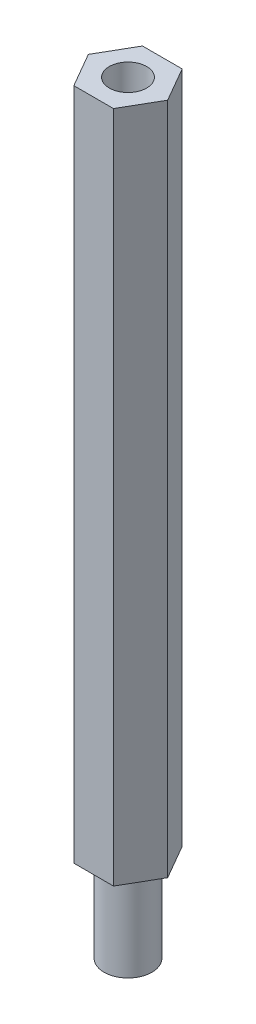
ISO-10303-21;
HEADER;
FILE_DESCRIPTION(('STEP AP214'),'2;1');
FILE_NAME('part.step','',(''),(''),'','','');
FILE_SCHEMA(('AUTOMOTIVE_DESIGN { 1 0 10303 214 1 1 1 1 }'));
ENDSEC;
DATA;
#1=APPLICATION_CONTEXT('core data for automotive mechanical design processes');
#2=APPLICATION_PROTOCOL_DEFINITION('international standard','automotive_design',2000,#1);
#3=PRODUCT_CONTEXT('',#1,'mechanical');
#4=PRODUCT('Part','Part','',(#3));
#5=PRODUCT_RELATED_PRODUCT_CATEGORY('part','',(#4));
#6=PRODUCT_DEFINITION_FORMATION('','',#4);
#7=PRODUCT_DEFINITION_CONTEXT('part definition',#1,'design');
#8=PRODUCT_DEFINITION('design','',#6,#7);
#9=PRODUCT_DEFINITION_SHAPE('','',#8);
#10=(LENGTH_UNIT() NAMED_UNIT(*) SI_UNIT(.MILLI.,.METRE.));
#11=(NAMED_UNIT(*) PLANE_ANGLE_UNIT() SI_UNIT($,.RADIAN.));
#12=(NAMED_UNIT(*) SI_UNIT($,.STERADIAN.) SOLID_ANGLE_UNIT());
#13=UNCERTAINTY_MEASURE_WITH_UNIT(LENGTH_MEASURE(1.E-05),#10,'distance_accuracy_value','');
#14=(GEOMETRIC_REPRESENTATION_CONTEXT(3) GLOBAL_UNCERTAINTY_ASSIGNED_CONTEXT((#13)) GLOBAL_UNIT_ASSIGNED_CONTEXT((#10,
#11,#12)) REPRESENTATION_CONTEXT('',''));
#15=CARTESIAN_POINT('',(0.,0.,0.));
#16=DIRECTION('',(0.,0.,1.));
#17=DIRECTION('',(1.,0.,0.));
#18=AXIS2_PLACEMENT_3D('',#15,#16,#17);
#19=CARTESIAN_POINT('',(-1.325,45.,2.29496732002876));
#20=DIRECTION('',(0.,0.,-1.));
#21=DIRECTION('',(-1.,0.,0.));
#22=AXIS2_PLACEMENT_3D('',#19,#20,#21);
#23=PLANE('',#22);
#24=DIRECTION('',(1.,0.,0.));
#25=VECTOR('',#24,1.);
#26=CARTESIAN_POINT('',(-1.325,0.,2.29496732002876));
#27=LINE('',#26,#25);
#28=CARTESIAN_POINT('',(-1.325,0.,2.29496732002876));
#29=VERTEX_POINT('',#28);
#30=CARTESIAN_POINT('',(1.325,0.,2.29496732002876));
#31=VERTEX_POINT('',#30);
#32=EDGE_CURVE('E122',#29,#31,#27,.T.);
#33=ORIENTED_EDGE('',*,*,#32,.T.);
#34=DIRECTION('',(0.,-1.,0.));
#35=VECTOR('',#34,1.);
#36=CARTESIAN_POINT('',(1.325,45.,2.29496732002876));
#37=LINE('',#36,#35);
#38=CARTESIAN_POINT('',(1.325,45.,2.29496732002876));
#39=VERTEX_POINT('',#38);
#40=EDGE_CURVE('E45',#39,#31,#37,.T.);
#41=ORIENTED_EDGE('',*,*,#40,.F.);
#42=DIRECTION('',(1.,0.,0.));
#43=VECTOR('',#42,1.);
#44=CARTESIAN_POINT('',(-1.325,45.,2.29496732002876));
#45=LINE('',#44,#43);
#46=CARTESIAN_POINT('',(-1.325,45.,2.29496732002876));
#47=VERTEX_POINT('',#46);
#48=EDGE_CURVE('E133',#47,#39,#45,.T.);
#49=ORIENTED_EDGE('',*,*,#48,.F.);
#50=DIRECTION('',(0.,-1.,0.));
#51=VECTOR('',#50,1.);
#52=CARTESIAN_POINT('',(-1.325,45.,2.29496732002876));
#53=LINE('',#52,#51);
#54=EDGE_CURVE('E118',#47,#29,#53,.T.);
#55=ORIENTED_EDGE('',*,*,#54,.T.);
#56=EDGE_LOOP('',(#33,#41,#49,#55));
#57=FACE_BOUND('',#56,.T.);
#58=ADVANCED_FACE('F37',(#57),#23,.F.);
#59=CARTESIAN_POINT('',(1.325,45.,2.29496732002876));
#60=DIRECTION('',(-0.866025403784439,0.,-0.5));
#61=DIRECTION('',(-0.5,0.,0.866025403784439));
#62=AXIS2_PLACEMENT_3D('',#59,#60,#61);
#63=PLANE('',#62);
#64=DIRECTION('',(0.5,0.,-0.866025403784439));
#65=VECTOR('',#64,1.);
#66=CARTESIAN_POINT('',(1.325,0.,2.29496732002876));
#67=LINE('',#66,#65);
#68=CARTESIAN_POINT('',(2.65,0.,0.));
#69=VERTEX_POINT('',#68);
#70=EDGE_CURVE('E125',#31,#69,#67,.T.);
#71=ORIENTED_EDGE('',*,*,#70,.T.);
#72=DIRECTION('',(0.,-1.,0.));
#73=VECTOR('',#72,1.);
#74=CARTESIAN_POINT('',(2.65,45.,0.));
#75=LINE('',#74,#73);
#76=CARTESIAN_POINT('',(2.65,45.,0.));
#77=VERTEX_POINT('',#76);
#78=EDGE_CURVE('E137',#77,#69,#75,.T.);
#79=ORIENTED_EDGE('',*,*,#78,.F.);
#80=DIRECTION('',(0.5,0.,-0.866025403784439));
#81=VECTOR('',#80,1.);
#82=CARTESIAN_POINT('',(1.325,45.,2.29496732002876));
#83=LINE('',#82,#81);
#84=EDGE_CURVE('E91',#39,#77,#83,.T.);
#85=ORIENTED_EDGE('',*,*,#84,.F.);
#86=ORIENTED_EDGE('',*,*,#40,.T.);
#87=EDGE_LOOP('',(#71,#79,#85,#86));
#88=FACE_BOUND('',#87,.T.);
#89=ADVANCED_FACE('F140',(#88),#63,.F.);
#90=CARTESIAN_POINT('',(2.65,45.,0.));
#91=DIRECTION('',(-0.866025403784438,0.,0.5));
#92=DIRECTION('',(0.5,0.,0.866025403784439));
#93=AXIS2_PLACEMENT_3D('',#90,#91,#92);
#94=PLANE('',#93);
#95=DIRECTION('',(-0.5,0.,-0.866025403784439));
#96=VECTOR('',#95,1.);
#97=CARTESIAN_POINT('',(2.65,0.,0.));
#98=LINE('',#97,#96);
#99=CARTESIAN_POINT('',(1.325,0.,-2.29496732002876));
#100=VERTEX_POINT('',#99);
#101=EDGE_CURVE('E128',#69,#100,#98,.T.);
#102=ORIENTED_EDGE('',*,*,#101,.T.);
#103=DIRECTION('',(0.,-1.,0.));
#104=VECTOR('',#103,1.);
#105=CARTESIAN_POINT('',(1.325,45.,-2.29496732002876));
#106=LINE('',#105,#104);
#107=CARTESIAN_POINT('',(1.325,45.,-2.29496732002876));
#108=VERTEX_POINT('',#107);
#109=EDGE_CURVE('E113',#108,#100,#106,.T.);
#110=ORIENTED_EDGE('',*,*,#109,.F.);
#111=DIRECTION('',(-0.5,0.,-0.866025403784439));
#112=VECTOR('',#111,1.);
#113=CARTESIAN_POINT('',(2.65,45.,0.));
#114=LINE('',#113,#112);
#115=EDGE_CURVE('E104',#77,#108,#114,.T.);
#116=ORIENTED_EDGE('',*,*,#115,.F.);
#117=ORIENTED_EDGE('',*,*,#78,.T.);
#118=EDGE_LOOP('',(#102,#110,#116,#117));
#119=FACE_BOUND('',#118,.T.);
#120=ADVANCED_FACE('F148',(#119),#94,.F.);
#121=CARTESIAN_POINT('',(1.325,45.,-2.29496732002876));
#122=DIRECTION('',(0.,0.,1.));
#123=DIRECTION('',(1.,0.,0.));
#124=AXIS2_PLACEMENT_3D('',#121,#122,#123);
#125=PLANE('',#124);
#126=DIRECTION('',(-1.,0.,0.));
#127=VECTOR('',#126,1.);
#128=CARTESIAN_POINT('',(1.325,0.,-2.29496732002876));
#129=LINE('',#128,#127);
#130=CARTESIAN_POINT('',(-1.325,0.,-2.29496732002876));
#131=VERTEX_POINT('',#130);
#132=EDGE_CURVE('E112',#100,#131,#129,.T.);
#133=ORIENTED_EDGE('',*,*,#132,.T.);
#134=DIRECTION('',(0.,-1.,0.));
#135=VECTOR('',#134,1.);
#136=CARTESIAN_POINT('',(-1.325,45.,-2.29496732002876));
#137=LINE('',#136,#135);
#138=CARTESIAN_POINT('',(-1.325,45.,-2.29496732002876));
#139=VERTEX_POINT('',#138);
#140=EDGE_CURVE('E109',#139,#131,#137,.T.);
#141=ORIENTED_EDGE('',*,*,#140,.F.);
#142=DIRECTION('',(-1.,0.,0.));
#143=VECTOR('',#142,1.);
#144=CARTESIAN_POINT('',(1.325,45.,-2.29496732002876));
#145=LINE('',#144,#143);
#146=EDGE_CURVE('E98',#108,#139,#145,.T.);
#147=ORIENTED_EDGE('',*,*,#146,.F.);
#148=ORIENTED_EDGE('',*,*,#109,.T.);
#149=EDGE_LOOP('',(#133,#141,#147,#148));
#150=FACE_BOUND('',#149,.T.);
#151=ADVANCED_FACE('F110',(#150),#125,.F.);
#152=CARTESIAN_POINT('',(-1.325,45.,-2.29496732002876));
#153=DIRECTION('',(0.866025403784439,0.,0.5));
#154=DIRECTION('',(0.5,0.,-0.866025403784439));
#155=AXIS2_PLACEMENT_3D('',#152,#153,#154);
#156=PLANE('',#155);
#157=DIRECTION('',(-0.5,0.,0.866025403784439));
#158=VECTOR('',#157,1.);
#159=CARTESIAN_POINT('',(-1.325,0.,-2.29496732002876));
#160=LINE('',#159,#158);
#161=CARTESIAN_POINT('',(-2.65,0.,0.));
#162=VERTEX_POINT('',#161);
#163=EDGE_CURVE('E76',#131,#162,#160,.T.);
#164=ORIENTED_EDGE('',*,*,#163,.T.);
#165=DIRECTION('',(0.,-1.,0.));
#166=VECTOR('',#165,1.);
#167=CARTESIAN_POINT('',(-2.65,45.,0.));
#168=LINE('',#167,#166);
#169=CARTESIAN_POINT('',(-2.65,45.,0.));
#170=VERTEX_POINT('',#169);
#171=EDGE_CURVE('E114',#170,#162,#168,.T.);
#172=ORIENTED_EDGE('',*,*,#171,.F.);
#173=DIRECTION('',(-0.5,0.,0.866025403784439));
#174=VECTOR('',#173,1.);
#175=CARTESIAN_POINT('',(-1.325,45.,-2.29496732002876));
#176=LINE('',#175,#174);
#177=EDGE_CURVE('E102',#139,#170,#176,.T.);
#178=ORIENTED_EDGE('',*,*,#177,.F.);
#179=ORIENTED_EDGE('',*,*,#140,.T.);
#180=EDGE_LOOP('',(#164,#172,#178,#179));
#181=FACE_BOUND('',#180,.T.);
#182=ADVANCED_FACE('F116',(#181),#156,.F.);
#183=CARTESIAN_POINT('',(-2.65,45.,0.));
#184=DIRECTION('',(0.866025403784438,0.,-0.5));
#185=DIRECTION('',(-0.5,0.,-0.866025403784439));
#186=AXIS2_PLACEMENT_3D('',#183,#184,#185);
#187=PLANE('',#186);
#188=DIRECTION('',(0.5,0.,0.866025403784439));
#189=VECTOR('',#188,1.);
#190=CARTESIAN_POINT('',(-2.65,0.,0.));
#191=LINE('',#190,#189);
#192=EDGE_CURVE('E82',#162,#29,#191,.T.);
#193=ORIENTED_EDGE('',*,*,#192,.T.);
#194=ORIENTED_EDGE('',*,*,#54,.F.);
#195=DIRECTION('',(0.5,0.,0.866025403784439));
#196=VECTOR('',#195,1.);
#197=CARTESIAN_POINT('',(-2.65,45.,0.));
#198=LINE('',#197,#196);
#199=EDGE_CURVE('E53',#170,#47,#198,.T.);
#200=ORIENTED_EDGE('',*,*,#199,.F.);
#201=ORIENTED_EDGE('',*,*,#171,.T.);
#202=EDGE_LOOP('',(#193,#194,#200,#201));
#203=FACE_BOUND('',#202,.T.);
#204=ADVANCED_FACE('F171',(#203),#187,.F.);
#205=CARTESIAN_POINT('',(0.,45.,0.));
#206=DIRECTION('',(0.,1.,0.));
#207=DIRECTION('',(0.,0.,1.));
#208=AXIS2_PLACEMENT_3D('',#205,#206,#207);
#209=PLANE('',#208);
#210=CARTESIAN_POINT('',(0.,45.,0.));
#211=DIRECTION('',(0.,1.,0.));
#212=DIRECTION('',(0.,0.,1.));
#213=AXIS2_PLACEMENT_3D('',#210,#211,#212);
#214=CIRCLE('',#213,1.25);
#215=CARTESIAN_POINT('',(0.,45.,1.25));
#216=VERTEX_POINT('',#215);
#217=EDGE_CURVE('E155',#216,#216,#214,.T.);
#218=ORIENTED_EDGE('',*,*,#217,.F.);
#219=EDGE_LOOP('',(#218));
#220=FACE_BOUND('',#219,.T.);
#221=ORIENTED_EDGE('',*,*,#48,.T.);
#222=ORIENTED_EDGE('',*,*,#84,.T.);
#223=ORIENTED_EDGE('',*,*,#115,.T.);
#224=ORIENTED_EDGE('',*,*,#146,.T.);
#225=ORIENTED_EDGE('',*,*,#177,.T.);
#226=ORIENTED_EDGE('',*,*,#199,.T.);
#227=EDGE_LOOP('',(#221,#222,#223,#224,#225,#226));
#228=FACE_BOUND('',#227,.T.);
#229=ADVANCED_FACE('F100',(#220,#228),#209,.T.);
#230=CARTESIAN_POINT('',(0.,0.,0.));
#231=DIRECTION('',(0.,1.,0.));
#232=DIRECTION('',(0.,0.,1.));
#233=AXIS2_PLACEMENT_3D('',#230,#231,#232);
#234=PLANE('',#233);
#235=CARTESIAN_POINT('',(0.,0.,0.));
#236=DIRECTION('',(0.,1.,0.));
#237=DIRECTION('',(0.,0.,1.));
#238=AXIS2_PLACEMENT_3D('',#235,#236,#237);
#239=CIRCLE('',#238,1.6);
#240=CARTESIAN_POINT('',(0.,0.,1.6));
#241=VERTEX_POINT('',#240);
#242=EDGE_CURVE('E11',#241,#241,#239,.F.);
#243=ORIENTED_EDGE('',*,*,#242,.F.);
#244=EDGE_LOOP('',(#243));
#245=FACE_BOUND('',#244,.T.);
#246=ORIENTED_EDGE('',*,*,#32,.F.);
#247=ORIENTED_EDGE('',*,*,#192,.F.);
#248=ORIENTED_EDGE('',*,*,#163,.F.);
#249=ORIENTED_EDGE('',*,*,#132,.F.);
#250=ORIENTED_EDGE('',*,*,#101,.F.);
#251=ORIENTED_EDGE('',*,*,#70,.F.);
#252=EDGE_LOOP('',(#246,#247,#248,#249,#250,#251));
#253=FACE_BOUND('',#252,.T.);
#254=ADVANCED_FACE('F145',(#245,#253),#234,.F.);
#255=CARTESIAN_POINT('',(0.,-6.,0.));
#256=DIRECTION('',(0.,1.,0.));
#257=DIRECTION('',(0.,0.,1.));
#258=AXIS2_PLACEMENT_3D('',#255,#256,#257);
#259=CYLINDRICAL_SURFACE('',#258,1.6);
#260=CARTESIAN_POINT('',(0.,-6.,0.));
#261=DIRECTION('',(0.,-1.,0.));
#262=DIRECTION('',(0.,0.,-1.));
#263=AXIS2_PLACEMENT_3D('',#260,#261,#262);
#264=CIRCLE('',#263,1.6);
#265=CARTESIAN_POINT('',(0.,-6.,-1.6));
#266=VERTEX_POINT('',#265);
#267=EDGE_CURVE('E126',#266,#266,#264,.T.);
#268=ORIENTED_EDGE('',*,*,#267,.F.);
#269=EDGE_LOOP('',(#268));
#270=FACE_BOUND('',#269,.T.);
#271=ORIENTED_EDGE('',*,*,#242,.T.);
#272=EDGE_LOOP('',(#271));
#273=FACE_BOUND('',#272,.T.);
#274=ADVANCED_FACE('F177',(#270,#273),#259,.T.);
#275=CARTESIAN_POINT('',(0.,-6.,0.));
#276=DIRECTION('',(0.,-1.,0.));
#277=DIRECTION('',(0.,0.,-1.));
#278=AXIS2_PLACEMENT_3D('',#275,#276,#277);
#279=PLANE('',#278);
#280=ORIENTED_EDGE('',*,*,#267,.T.);
#281=EDGE_LOOP('',(#280));
#282=FACE_BOUND('',#281,.T.);
#283=ADVANCED_FACE('F166',(#282),#279,.T.);
#284=CARTESIAN_POINT('',(0.,40.,0.));
#285=DIRECTION('',(0.,1.,0.));
#286=DIRECTION('',(0.,0.,1.));
#287=AXIS2_PLACEMENT_3D('',#284,#285,#286);
#288=CYLINDRICAL_SURFACE('',#287,1.25);
#289=CARTESIAN_POINT('',(0.,40.,0.));
#290=DIRECTION('',(0.,1.,0.));
#291=DIRECTION('',(0.,0.,1.));
#292=AXIS2_PLACEMENT_3D('',#289,#290,#291);
#293=CIRCLE('',#292,1.25);
#294=CARTESIAN_POINT('',(0.,40.,1.25));
#295=VERTEX_POINT('',#294);
#296=EDGE_CURVE('E154',#295,#295,#293,.T.);
#297=ORIENTED_EDGE('',*,*,#296,.F.);
#298=EDGE_LOOP('',(#297));
#299=FACE_BOUND('',#298,.T.);
#300=ORIENTED_EDGE('',*,*,#217,.T.);
#301=EDGE_LOOP('',(#300));
#302=FACE_BOUND('',#301,.T.);
#303=ADVANCED_FACE('F163',(#299,#302),#288,.F.);
#304=CARTESIAN_POINT('',(0.,40.,0.));
#305=DIRECTION('',(0.,1.,0.));
#306=DIRECTION('',(0.,0.,1.));
#307=AXIS2_PLACEMENT_3D('',#304,#305,#306);
#308=PLANE('',#307);
#309=ORIENTED_EDGE('',*,*,#296,.T.);
#310=EDGE_LOOP('',(#309));
#311=FACE_BOUND('',#310,.T.);
#312=ADVANCED_FACE('F161',(#311),#308,.T.);
#313=CLOSED_SHELL('',(#58,#89,#120,#151,#182,#204,#229,#254,#274,#283,#303,#312));
#314=MANIFOLD_SOLID_BREP('B2',#313);
#315=ADVANCED_BREP_SHAPE_REPRESENTATION('',(#18,#314),#14);
#316=SHAPE_DEFINITION_REPRESENTATION(#9,#315);
ENDSEC;
END-ISO-10303-21;
